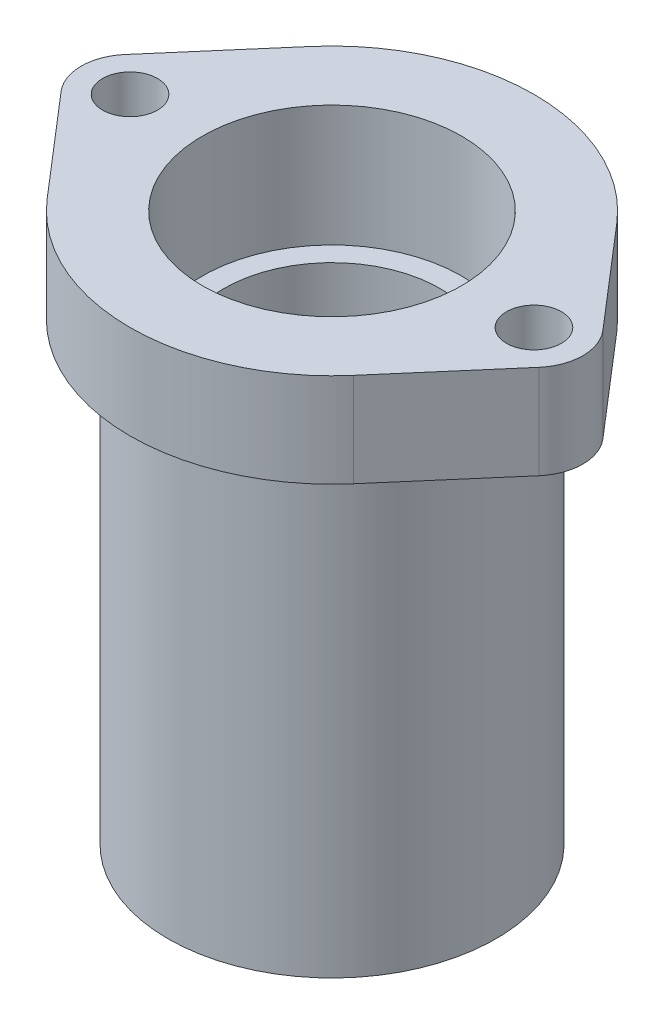
ISO-10303-21;
HEADER;
FILE_DESCRIPTION(('STEP AP214'),'2;1');
FILE_NAME('part.step','',(''),(''),'','','');
FILE_SCHEMA(('AUTOMOTIVE_DESIGN { 1 0 10303 214 1 1 1 1 }'));
ENDSEC;
DATA;
#1=APPLICATION_CONTEXT('core data for automotive mechanical design processes');
#2=APPLICATION_PROTOCOL_DEFINITION('international standard','automotive_design',2000,#1);
#3=PRODUCT_CONTEXT('',#1,'mechanical');
#4=PRODUCT('Part','Part','',(#3));
#5=PRODUCT_RELATED_PRODUCT_CATEGORY('part','',(#4));
#6=PRODUCT_DEFINITION_FORMATION('','',#4);
#7=PRODUCT_DEFINITION_CONTEXT('part definition',#1,'design');
#8=PRODUCT_DEFINITION('design','',#6,#7);
#9=PRODUCT_DEFINITION_SHAPE('','',#8);
#10=(LENGTH_UNIT() NAMED_UNIT(*) SI_UNIT(.MILLI.,.METRE.));
#11=(NAMED_UNIT(*) PLANE_ANGLE_UNIT() SI_UNIT($,.RADIAN.));
#12=(NAMED_UNIT(*) SI_UNIT($,.STERADIAN.) SOLID_ANGLE_UNIT());
#13=UNCERTAINTY_MEASURE_WITH_UNIT(LENGTH_MEASURE(1.E-05),#10,'distance_accuracy_value','');
#14=(GEOMETRIC_REPRESENTATION_CONTEXT(3) GLOBAL_UNCERTAINTY_ASSIGNED_CONTEXT((#13)) GLOBAL_UNIT_ASSIGNED_CONTEXT((#10,
#11,#12)) REPRESENTATION_CONTEXT('',''));
#15=CARTESIAN_POINT('',(0.,0.,0.));
#16=DIRECTION('',(0.,0.,1.));
#17=DIRECTION('',(1.,0.,0.));
#18=AXIS2_PLACEMENT_3D('',#15,#16,#17);
#19=CARTESIAN_POINT('',(-12.7,5.9055,0.));
#20=DIRECTION('',(0.,1.,0.));
#21=DIRECTION('',(0.,0.,1.));
#22=AXIS2_PLACEMENT_3D('',#19,#20,#21);
#23=PLANE('',#22);
#24=CARTESIAN_POINT('',(0.,5.9055,0.));
#25=DIRECTION('',(0.,1.,0.));
#26=DIRECTION('',(0.,0.,1.));
#27=AXIS2_PLACEMENT_3D('',#24,#25,#26);
#28=CIRCLE('',#27,8.1534);
#29=CARTESIAN_POINT('',(0.,5.9055,8.1534));
#30=VERTEX_POINT('',#29);
#31=EDGE_CURVE('E167',#30,#30,#28,.T.);
#32=ORIENTED_EDGE('',*,*,#31,.F.);
#33=EDGE_LOOP('',(#32));
#34=FACE_BOUND('',#33,.T.);
#35=CARTESIAN_POINT('',(-12.7,5.9055,0.));
#36=DIRECTION('',(0.,1.,0.));
#37=DIRECTION('',(0.,0.,1.));
#38=AXIS2_PLACEMENT_3D('',#35,#36,#37);
#39=CIRCLE('',#38,1.7272);
#40=CARTESIAN_POINT('',(-12.7,5.9055,1.7272));
#41=VERTEX_POINT('',#40);
#42=EDGE_CURVE('E141',#41,#41,#39,.T.);
#43=ORIENTED_EDGE('',*,*,#42,.F.);
#44=EDGE_LOOP('',(#43));
#45=FACE_BOUND('',#44,.T.);
#46=CARTESIAN_POINT('',(-12.7,5.9055,0.));
#47=DIRECTION('',(0.,1.,0.));
#48=DIRECTION('',(0.,0.,1.));
#49=AXIS2_PLACEMENT_3D('',#46,#47,#48);
#50=CIRCLE('',#49,3.0734);
#51=CARTESIAN_POINT('',(-15.0296372,5.9055,-2.00463913869209));
#52=VERTEX_POINT('',#51);
#53=CARTESIAN_POINT('',(-15.0296372,5.9055,2.00463913869209));
#54=VERTEX_POINT('',#53);
#55=EDGE_CURVE('E152',#52,#54,#50,.T.);
#56=ORIENTED_EDGE('',*,*,#55,.T.);
#57=DIRECTION('',(0.652254551536438,0.,0.758));
#58=VECTOR('',#57,1.);
#59=CARTESIAN_POINT('',(-15.0296372,5.9055,2.00463913869209));
#60=LINE('',#59,#58);
#61=CARTESIAN_POINT('',(-9.62660000000001,5.9055,8.28363280451276));
#62=VERTEX_POINT('',#61);
#63=EDGE_CURVE('E100',#54,#62,#60,.T.);
#64=ORIENTED_EDGE('',*,*,#63,.T.);
#65=CARTESIAN_POINT('',(0.,5.9055,0.));
#66=DIRECTION('',(0.,1.,0.));
#67=DIRECTION('',(0.,0.,1.));
#68=AXIS2_PLACEMENT_3D('',#65,#66,#67);
#69=CIRCLE('',#68,12.7);
#70=CARTESIAN_POINT('',(9.6266,5.9055,8.28363280451276));
#71=VERTEX_POINT('',#70);
#72=EDGE_CURVE('E200',#62,#71,#69,.T.);
#73=ORIENTED_EDGE('',*,*,#72,.T.);
#74=DIRECTION('',(0.652254551536438,0.,-0.758));
#75=VECTOR('',#74,1.);
#76=CARTESIAN_POINT('',(15.0296372,5.9055,2.00463913869209));
#77=LINE('',#76,#75);
#78=CARTESIAN_POINT('',(15.0296372,5.9055,2.00463913869209));
#79=VERTEX_POINT('',#78);
#80=EDGE_CURVE('E202',#71,#79,#77,.T.);
#81=ORIENTED_EDGE('',*,*,#80,.T.);
#82=CARTESIAN_POINT('',(12.7,5.9055,0.));
#83=DIRECTION('',(0.,1.,0.));
#84=DIRECTION('',(0.,0.,1.));
#85=AXIS2_PLACEMENT_3D('',#82,#83,#84);
#86=CIRCLE('',#85,3.0734);
#87=CARTESIAN_POINT('',(15.0296372,5.9055,-2.00463913869209));
#88=VERTEX_POINT('',#87);
#89=EDGE_CURVE('E119',#79,#88,#86,.T.);
#90=ORIENTED_EDGE('',*,*,#89,.T.);
#91=DIRECTION('',(-0.652254551536438,0.,-0.758));
#92=VECTOR('',#91,1.);
#93=CARTESIAN_POINT('',(9.6266,5.9055,-8.28363280451276));
#94=LINE('',#93,#92);
#95=CARTESIAN_POINT('',(9.6266,5.9055,-8.28363280451276));
#96=VERTEX_POINT('',#95);
#97=EDGE_CURVE('E113',#88,#96,#94,.T.);
#98=ORIENTED_EDGE('',*,*,#97,.T.);
#99=CARTESIAN_POINT('',(0.,5.9055,0.));
#100=DIRECTION('',(0.,1.,0.));
#101=DIRECTION('',(0.,0.,1.));
#102=AXIS2_PLACEMENT_3D('',#99,#100,#101);
#103=CIRCLE('',#102,12.7);
#104=CARTESIAN_POINT('',(-9.6266,5.9055,-8.28363280451276));
#105=VERTEX_POINT('',#104);
#106=EDGE_CURVE('E117',#96,#105,#103,.T.);
#107=ORIENTED_EDGE('',*,*,#106,.T.);
#108=DIRECTION('',(-0.652254551536438,0.,0.758));
#109=VECTOR('',#108,1.);
#110=CARTESIAN_POINT('',(-15.0296372,5.9055,-2.00463913869209));
#111=LINE('',#110,#109);
#112=EDGE_CURVE('E56',#105,#52,#111,.T.);
#113=ORIENTED_EDGE('',*,*,#112,.T.);
#114=EDGE_LOOP('',(#56,#64,#73,#81,#90,#98,#107,#113));
#115=FACE_BOUND('',#114,.T.);
#116=CARTESIAN_POINT('',(12.7,5.9055,0.));
#117=DIRECTION('',(0.,1.,0.));
#118=DIRECTION('',(0.,0.,1.));
#119=AXIS2_PLACEMENT_3D('',#116,#117,#118);
#120=CIRCLE('',#119,1.7272);
#121=CARTESIAN_POINT('',(12.7,5.9055,1.7272));
#122=VERTEX_POINT('',#121);
#123=EDGE_CURVE('E188',#122,#122,#120,.T.);
#124=ORIENTED_EDGE('',*,*,#123,.F.);
#125=EDGE_LOOP('',(#124));
#126=FACE_BOUND('',#125,.T.);
#127=ADVANCED_FACE('F37',(#34,#45,#115,#126),#23,.T.);
#128=CARTESIAN_POINT('',(-12.7,0.,0.));
#129=DIRECTION('',(0.,1.,0.));
#130=DIRECTION('',(0.,0.,1.));
#131=AXIS2_PLACEMENT_3D('',#128,#129,#130);
#132=PLANE('',#131);
#133=CARTESIAN_POINT('',(0.,0.,0.));
#134=DIRECTION('',(0.,1.,0.));
#135=DIRECTION('',(0.,0.,1.));
#136=AXIS2_PLACEMENT_3D('',#133,#134,#135);
#137=CIRCLE('',#136,10.31875);
#138=CARTESIAN_POINT('',(0.,0.,10.31875));
#139=VERTEX_POINT('',#138);
#140=EDGE_CURVE('E11',#139,#139,#137,.F.);
#141=ORIENTED_EDGE('',*,*,#140,.F.);
#142=EDGE_LOOP('',(#141));
#143=FACE_BOUND('',#142,.T.);
#144=CARTESIAN_POINT('',(-12.7,0.,0.));
#145=DIRECTION('',(0.,1.,0.));
#146=DIRECTION('',(0.,0.,1.));
#147=AXIS2_PLACEMENT_3D('',#144,#145,#146);
#148=CIRCLE('',#147,3.0734);
#149=CARTESIAN_POINT('',(-15.0296372,0.,-2.00463913869209));
#150=VERTEX_POINT('',#149);
#151=CARTESIAN_POINT('',(-15.0296372,0.,2.00463913869209));
#152=VERTEX_POINT('',#151);
#153=EDGE_CURVE('E137',#150,#152,#148,.T.);
#154=ORIENTED_EDGE('',*,*,#153,.F.);
#155=DIRECTION('',(-0.652254551536438,0.,0.758));
#156=VECTOR('',#155,1.);
#157=CARTESIAN_POINT('',(-15.0296372,0.,-2.00463913869209));
#158=LINE('',#157,#156);
#159=CARTESIAN_POINT('',(-9.6266,0.,-8.28363280451276));
#160=VERTEX_POINT('',#159);
#161=EDGE_CURVE('E91',#160,#150,#158,.T.);
#162=ORIENTED_EDGE('',*,*,#161,.F.);
#163=CARTESIAN_POINT('',(0.,0.,0.));
#164=DIRECTION('',(0.,1.,0.));
#165=DIRECTION('',(0.,0.,1.));
#166=AXIS2_PLACEMENT_3D('',#163,#164,#165);
#167=CIRCLE('',#166,12.7);
#168=CARTESIAN_POINT('',(9.6266,0.,-8.28363280451276));
#169=VERTEX_POINT('',#168);
#170=EDGE_CURVE('E85',#169,#160,#167,.T.);
#171=ORIENTED_EDGE('',*,*,#170,.F.);
#172=DIRECTION('',(-0.652254551536438,0.,-0.758));
#173=VECTOR('',#172,1.);
#174=CARTESIAN_POINT('',(9.6266,0.,-8.28363280451276));
#175=LINE('',#174,#173);
#176=CARTESIAN_POINT('',(15.0296372,0.,-2.00463913869209));
#177=VERTEX_POINT('',#176);
#178=EDGE_CURVE('E127',#177,#169,#175,.T.);
#179=ORIENTED_EDGE('',*,*,#178,.F.);
#180=CARTESIAN_POINT('',(12.7,0.,0.));
#181=DIRECTION('',(0.,1.,0.));
#182=DIRECTION('',(0.,0.,1.));
#183=AXIS2_PLACEMENT_3D('',#180,#181,#182);
#184=CIRCLE('',#183,3.0734);
#185=CARTESIAN_POINT('',(15.0296372,0.,2.00463913869209));
#186=VERTEX_POINT('',#185);
#187=EDGE_CURVE('E147',#186,#177,#184,.T.);
#188=ORIENTED_EDGE('',*,*,#187,.F.);
#189=DIRECTION('',(0.652254551536438,0.,-0.758));
#190=VECTOR('',#189,1.);
#191=CARTESIAN_POINT('',(15.0296372,0.,2.00463913869209));
#192=LINE('',#191,#190);
#193=CARTESIAN_POINT('',(9.6266,0.,8.28363280451276));
#194=VERTEX_POINT('',#193);
#195=EDGE_CURVE('E145',#194,#186,#192,.T.);
#196=ORIENTED_EDGE('',*,*,#195,.F.);
#197=CARTESIAN_POINT('',(0.,0.,0.));
#198=DIRECTION('',(0.,1.,0.));
#199=DIRECTION('',(0.,0.,1.));
#200=AXIS2_PLACEMENT_3D('',#197,#198,#199);
#201=CIRCLE('',#200,12.7);
#202=CARTESIAN_POINT('',(-9.62660000000001,0.,8.28363280451276));
#203=VERTEX_POINT('',#202);
#204=EDGE_CURVE('E143',#203,#194,#201,.T.);
#205=ORIENTED_EDGE('',*,*,#204,.F.);
#206=DIRECTION('',(0.652254551536438,0.,0.758));
#207=VECTOR('',#206,1.);
#208=CARTESIAN_POINT('',(-15.0296372,0.,2.00463913869209));
#209=LINE('',#208,#207);
#210=EDGE_CURVE('E140',#152,#203,#209,.T.);
#211=ORIENTED_EDGE('',*,*,#210,.F.);
#212=EDGE_LOOP('',(#154,#162,#171,#179,#188,#196,#205,#211));
#213=FACE_BOUND('',#212,.T.);
#214=CARTESIAN_POINT('',(-12.7,0.,0.));
#215=DIRECTION('',(0.,1.,0.));
#216=DIRECTION('',(0.,0.,1.));
#217=AXIS2_PLACEMENT_3D('',#214,#215,#216);
#218=CIRCLE('',#217,1.7272);
#219=CARTESIAN_POINT('',(-12.7,0.,1.7272));
#220=VERTEX_POINT('',#219);
#221=EDGE_CURVE('E191',#220,#220,#218,.T.);
#222=ORIENTED_EDGE('',*,*,#221,.T.);
#223=EDGE_LOOP('',(#222));
#224=FACE_BOUND('',#223,.T.);
#225=CARTESIAN_POINT('',(12.7,0.,0.));
#226=DIRECTION('',(0.,1.,0.));
#227=DIRECTION('',(0.,0.,1.));
#228=AXIS2_PLACEMENT_3D('',#225,#226,#227);
#229=CIRCLE('',#228,1.7272);
#230=CARTESIAN_POINT('',(12.7,0.,1.7272));
#231=VERTEX_POINT('',#230);
#232=EDGE_CURVE('E187',#231,#231,#229,.T.);
#233=ORIENTED_EDGE('',*,*,#232,.T.);
#234=EDGE_LOOP('',(#233));
#235=FACE_BOUND('',#234,.T.);
#236=ADVANCED_FACE('F215',(#143,#213,#224,#235),#132,.F.);
#237=CARTESIAN_POINT('',(-12.7,5.9055,0.));
#238=DIRECTION('',(0.,-1.,0.));
#239=DIRECTION('',(0.,0.,-1.));
#240=AXIS2_PLACEMENT_3D('',#237,#238,#239);
#241=CYLINDRICAL_SURFACE('',#240,3.0734);
#242=ORIENTED_EDGE('',*,*,#153,.T.);
#243=DIRECTION('',(0.,-1.,0.));
#244=VECTOR('',#243,1.);
#245=CARTESIAN_POINT('',(-15.0296372,5.9055,2.00463913869209));
#246=LINE('',#245,#244);
#247=EDGE_CURVE('E47',#54,#152,#246,.T.);
#248=ORIENTED_EDGE('',*,*,#247,.F.);
#249=ORIENTED_EDGE('',*,*,#55,.F.);
#250=DIRECTION('',(0.,-1.,0.));
#251=VECTOR('',#250,1.);
#252=CARTESIAN_POINT('',(-15.0296372,5.9055,-2.00463913869209));
#253=LINE('',#252,#251);
#254=EDGE_CURVE('E133',#52,#150,#253,.T.);
#255=ORIENTED_EDGE('',*,*,#254,.T.);
#256=EDGE_LOOP('',(#242,#248,#249,#255));
#257=FACE_BOUND('',#256,.T.);
#258=ADVANCED_FACE('F39',(#257),#241,.T.);
#259=CARTESIAN_POINT('',(-15.0296372,5.9055,2.00463913869209));
#260=DIRECTION('',(0.758,0.,-0.652254551536438));
#261=DIRECTION('',(-0.652254551536438,0.,-0.758));
#262=AXIS2_PLACEMENT_3D('',#259,#260,#261);
#263=PLANE('',#262);
#264=ORIENTED_EDGE('',*,*,#210,.T.);
#265=DIRECTION('',(0.,-1.,0.));
#266=VECTOR('',#265,1.);
#267=CARTESIAN_POINT('',(-9.62660000000001,5.9055,8.28363280451276));
#268=LINE('',#267,#266);
#269=EDGE_CURVE('E162',#62,#203,#268,.T.);
#270=ORIENTED_EDGE('',*,*,#269,.F.);
#271=ORIENTED_EDGE('',*,*,#63,.F.);
#272=ORIENTED_EDGE('',*,*,#247,.T.);
#273=EDGE_LOOP('',(#264,#270,#271,#272));
#274=FACE_BOUND('',#273,.T.);
#275=ADVANCED_FACE('F360',(#274),#263,.F.);
#276=CARTESIAN_POINT('',(0.,5.9055,0.));
#277=DIRECTION('',(0.,-1.,0.));
#278=DIRECTION('',(0.,0.,-1.));
#279=AXIS2_PLACEMENT_3D('',#276,#277,#278);
#280=CYLINDRICAL_SURFACE('',#279,12.7);
#281=ORIENTED_EDGE('',*,*,#204,.T.);
#282=DIRECTION('',(0.,-1.,0.));
#283=VECTOR('',#282,1.);
#284=CARTESIAN_POINT('',(9.6266,5.9055,8.28363280451276));
#285=LINE('',#284,#283);
#286=EDGE_CURVE('E159',#71,#194,#285,.T.);
#287=ORIENTED_EDGE('',*,*,#286,.F.);
#288=ORIENTED_EDGE('',*,*,#72,.F.);
#289=ORIENTED_EDGE('',*,*,#269,.T.);
#290=EDGE_LOOP('',(#281,#287,#288,#289));
#291=FACE_BOUND('',#290,.T.);
#292=ADVANCED_FACE('F351',(#291),#280,.T.);
#293=CARTESIAN_POINT('',(15.0296372,5.9055,2.00463913869209));
#294=DIRECTION('',(-0.758,0.,-0.652254551536438));
#295=DIRECTION('',(-0.652254551536438,0.,0.758));
#296=AXIS2_PLACEMENT_3D('',#293,#294,#295);
#297=PLANE('',#296);
#298=ORIENTED_EDGE('',*,*,#195,.T.);
#299=DIRECTION('',(0.,-1.,0.));
#300=VECTOR('',#299,1.);
#301=CARTESIAN_POINT('',(15.0296372,5.9055,2.00463913869209));
#302=LINE('',#301,#300);
#303=EDGE_CURVE('E156',#79,#186,#302,.T.);
#304=ORIENTED_EDGE('',*,*,#303,.F.);
#305=ORIENTED_EDGE('',*,*,#80,.F.);
#306=ORIENTED_EDGE('',*,*,#286,.T.);
#307=EDGE_LOOP('',(#298,#304,#305,#306));
#308=FACE_BOUND('',#307,.T.);
#309=ADVANCED_FACE('F208',(#308),#297,.F.);
#310=CARTESIAN_POINT('',(12.7,5.9055,0.));
#311=DIRECTION('',(0.,-1.,0.));
#312=DIRECTION('',(0.,0.,-1.));
#313=AXIS2_PLACEMENT_3D('',#310,#311,#312);
#314=CYLINDRICAL_SURFACE('',#313,3.0734);
#315=ORIENTED_EDGE('',*,*,#187,.T.);
#316=DIRECTION('',(0.,-1.,0.));
#317=VECTOR('',#316,1.);
#318=CARTESIAN_POINT('',(15.0296372,5.9055,-2.00463913869209));
#319=LINE('',#318,#317);
#320=EDGE_CURVE('E128',#88,#177,#319,.T.);
#321=ORIENTED_EDGE('',*,*,#320,.F.);
#322=ORIENTED_EDGE('',*,*,#89,.F.);
#323=ORIENTED_EDGE('',*,*,#303,.T.);
#324=EDGE_LOOP('',(#315,#321,#322,#323));
#325=FACE_BOUND('',#324,.T.);
#326=ADVANCED_FACE('F212',(#325),#314,.T.);
#327=CARTESIAN_POINT('',(9.6266,5.9055,-8.28363280451276));
#328=DIRECTION('',(-0.758,0.,0.652254551536438));
#329=DIRECTION('',(0.652254551536438,0.,0.758));
#330=AXIS2_PLACEMENT_3D('',#327,#328,#329);
#331=PLANE('',#330);
#332=ORIENTED_EDGE('',*,*,#178,.T.);
#333=DIRECTION('',(0.,-1.,0.));
#334=VECTOR('',#333,1.);
#335=CARTESIAN_POINT('',(9.6266,5.9055,-8.28363280451276));
#336=LINE('',#335,#334);
#337=EDGE_CURVE('E124',#96,#169,#336,.T.);
#338=ORIENTED_EDGE('',*,*,#337,.F.);
#339=ORIENTED_EDGE('',*,*,#97,.F.);
#340=ORIENTED_EDGE('',*,*,#320,.T.);
#341=EDGE_LOOP('',(#332,#338,#339,#340));
#342=FACE_BOUND('',#341,.T.);
#343=ADVANCED_FACE('F125',(#342),#331,.F.);
#344=CARTESIAN_POINT('',(0.,5.9055,0.));
#345=DIRECTION('',(0.,-1.,0.));
#346=DIRECTION('',(0.,0.,-1.));
#347=AXIS2_PLACEMENT_3D('',#344,#345,#346);
#348=CYLINDRICAL_SURFACE('',#347,12.7);
#349=ORIENTED_EDGE('',*,*,#170,.T.);
#350=DIRECTION('',(0.,-1.,0.));
#351=VECTOR('',#350,1.);
#352=CARTESIAN_POINT('',(-9.6266,5.9055,-8.28363280451276));
#353=LINE('',#352,#351);
#354=EDGE_CURVE('E129',#105,#160,#353,.T.);
#355=ORIENTED_EDGE('',*,*,#354,.F.);
#356=ORIENTED_EDGE('',*,*,#106,.F.);
#357=ORIENTED_EDGE('',*,*,#337,.T.);
#358=EDGE_LOOP('',(#349,#355,#356,#357));
#359=FACE_BOUND('',#358,.T.);
#360=ADVANCED_FACE('F131',(#359),#348,.T.);
#361=CARTESIAN_POINT('',(-15.0296372,5.9055,-2.00463913869209));
#362=DIRECTION('',(0.758,0.,0.652254551536438));
#363=DIRECTION('',(0.652254551536438,0.,-0.758));
#364=AXIS2_PLACEMENT_3D('',#361,#362,#363);
#365=PLANE('',#364);
#366=ORIENTED_EDGE('',*,*,#161,.T.);
#367=ORIENTED_EDGE('',*,*,#254,.F.);
#368=ORIENTED_EDGE('',*,*,#112,.F.);
#369=ORIENTED_EDGE('',*,*,#354,.T.);
#370=EDGE_LOOP('',(#366,#367,#368,#369));
#371=FACE_BOUND('',#370,.T.);
#372=ADVANCED_FACE('F221',(#371),#365,.F.);
#373=CARTESIAN_POINT('',(-12.7,5.9055,0.));
#374=DIRECTION('',(0.,-1.,0.));
#375=DIRECTION('',(0.,0.,-1.));
#376=AXIS2_PLACEMENT_3D('',#373,#374,#375);
#377=CYLINDRICAL_SURFACE('',#376,1.7272);
#378=ORIENTED_EDGE('',*,*,#42,.T.);
#379=EDGE_LOOP('',(#378));
#380=FACE_BOUND('',#379,.T.);
#381=ORIENTED_EDGE('',*,*,#221,.F.);
#382=EDGE_LOOP('',(#381));
#383=FACE_BOUND('',#382,.T.);
#384=ADVANCED_FACE('F223',(#380,#383),#377,.F.);
#385=CARTESIAN_POINT('',(12.7,5.9055,0.));
#386=DIRECTION('',(0.,-1.,0.));
#387=DIRECTION('',(0.,0.,-1.));
#388=AXIS2_PLACEMENT_3D('',#385,#386,#387);
#389=CYLINDRICAL_SURFACE('',#388,1.7272);
#390=ORIENTED_EDGE('',*,*,#123,.T.);
#391=EDGE_LOOP('',(#390));
#392=FACE_BOUND('',#391,.T.);
#393=ORIENTED_EDGE('',*,*,#232,.F.);
#394=EDGE_LOOP('',(#393));
#395=FACE_BOUND('',#394,.T.);
#396=ADVANCED_FACE('F229',(#392,#395),#389,.F.);
#397=CARTESIAN_POINT('',(0.,-28.575,0.));
#398=DIRECTION('',(0.,1.,0.));
#399=DIRECTION('',(0.,0.,1.));
#400=AXIS2_PLACEMENT_3D('',#397,#398,#399);
#401=CYLINDRICAL_SURFACE('',#400,10.31875);
#402=CARTESIAN_POINT('',(0.,-28.575,0.));
#403=DIRECTION('',(0.,-1.,0.));
#404=DIRECTION('',(0.,0.,-1.));
#405=AXIS2_PLACEMENT_3D('',#402,#403,#404);
#406=CIRCLE('',#405,10.31875);
#407=CARTESIAN_POINT('',(0.,-28.575,-10.31875));
#408=VERTEX_POINT('',#407);
#409=EDGE_CURVE('E183',#408,#408,#406,.T.);
#410=ORIENTED_EDGE('',*,*,#409,.F.);
#411=EDGE_LOOP('',(#410));
#412=FACE_BOUND('',#411,.T.);
#413=ORIENTED_EDGE('',*,*,#140,.T.);
#414=EDGE_LOOP('',(#413));
#415=FACE_BOUND('',#414,.T.);
#416=ADVANCED_FACE('F246',(#412,#415),#401,.T.);
#417=CARTESIAN_POINT('',(0.,-28.575,0.));
#418=DIRECTION('',(0.,-1.,0.));
#419=DIRECTION('',(0.,0.,-1.));
#420=AXIS2_PLACEMENT_3D('',#417,#418,#419);
#421=PLANE('',#420);
#422=CARTESIAN_POINT('',(0.,-28.575,0.));
#423=DIRECTION('',(0.,1.,0.));
#424=DIRECTION('',(0.,0.,1.));
#425=AXIS2_PLACEMENT_3D('',#422,#423,#424);
#426=CIRCLE('',#425,5.08);
#427=CARTESIAN_POINT('',(0.,-28.575,5.08));
#428=VERTEX_POINT('',#427);
#429=EDGE_CURVE('E179',#428,#428,#426,.T.);
#430=ORIENTED_EDGE('',*,*,#429,.T.);
#431=EDGE_LOOP('',(#430));
#432=FACE_BOUND('',#431,.T.);
#433=ORIENTED_EDGE('',*,*,#409,.T.);
#434=EDGE_LOOP('',(#433));
#435=FACE_BOUND('',#434,.T.);
#436=ADVANCED_FACE('F250',(#432,#435),#421,.T.);
#437=CARTESIAN_POINT('',(0.,-1.7145,0.));
#438=DIRECTION('',(0.,1.,0.));
#439=DIRECTION('',(0.,0.,1.));
#440=AXIS2_PLACEMENT_3D('',#437,#438,#439);
#441=CYLINDRICAL_SURFACE('',#440,8.1534);
#442=CARTESIAN_POINT('',(0.,-1.7145,0.));
#443=DIRECTION('',(0.,1.,0.));
#444=DIRECTION('',(0.,0.,1.));
#445=AXIS2_PLACEMENT_3D('',#442,#443,#444);
#446=CIRCLE('',#445,8.1534);
#447=CARTESIAN_POINT('',(0.,-1.7145,8.1534));
#448=VERTEX_POINT('',#447);
#449=EDGE_CURVE('E172',#448,#448,#446,.T.);
#450=CARTESIAN_POINT('',(0.,-1.7145,8.1534));
#451=CARTESIAN_POINT('',(0.,-1.635125,8.1534));
#452=CARTESIAN_POINT('',(0.,-1.55575,8.1534));
#453=CARTESIAN_POINT('',(0.,-1.397,8.1534));
#454=CARTESIAN_POINT('',(0.,-1.317625,8.1534));
#455=CARTESIAN_POINT('',(0.,-1.158875,8.1534));
#456=CARTESIAN_POINT('',(0.,-1.0795,8.1534));
#457=CARTESIAN_POINT('',(0.,-0.920749999999999,8.1534));
#458=CARTESIAN_POINT('',(0.,-0.841374999999999,8.1534));
#459=CARTESIAN_POINT('',(0.,-0.682624999999999,8.1534));
#460=CARTESIAN_POINT('',(0.,-0.603249999999999,8.1534));
#461=CARTESIAN_POINT('',(0.,-0.444499999999999,8.1534));
#462=CARTESIAN_POINT('',(0.,-0.365124999999999,8.1534));
#463=CARTESIAN_POINT('',(0.,-0.206374999999999,8.1534));
#464=CARTESIAN_POINT('',(0.,-0.126999999999999,8.1534));
#465=CARTESIAN_POINT('',(0.,0.0317500000000007,8.1534));
#466=CARTESIAN_POINT('',(0.,0.111125000000001,8.1534));
#467=CARTESIAN_POINT('',(0.,0.269875000000001,8.1534));
#468=CARTESIAN_POINT('',(0.,0.349250000000001,8.1534));
#469=CARTESIAN_POINT('',(0.,0.508000000000001,8.1534));
#470=CARTESIAN_POINT('',(0.,0.587375000000001,8.1534));
#471=CARTESIAN_POINT('',(0.,0.746125000000001,8.1534));
#472=CARTESIAN_POINT('',(0.,0.825500000000001,8.1534));
#473=CARTESIAN_POINT('',(0.,0.984250000000001,8.1534));
#474=CARTESIAN_POINT('',(0.,1.063625,8.1534));
#475=CARTESIAN_POINT('',(0.,1.222375,8.1534));
#476=CARTESIAN_POINT('',(0.,1.30175,8.1534));
#477=CARTESIAN_POINT('',(0.,1.4605,8.1534));
#478=CARTESIAN_POINT('',(0.,1.539875,8.1534));
#479=CARTESIAN_POINT('',(0.,1.698625,8.1534));
#480=CARTESIAN_POINT('',(0.,1.778,8.1534));
#481=CARTESIAN_POINT('',(0.,1.93675,8.1534));
#482=CARTESIAN_POINT('',(0.,2.016125,8.1534));
#483=CARTESIAN_POINT('',(0.,2.174875,8.1534));
#484=CARTESIAN_POINT('',(0.,2.25425,8.1534));
#485=CARTESIAN_POINT('',(0.,2.413,8.1534));
#486=CARTESIAN_POINT('',(0.,2.492375,8.1534));
#487=CARTESIAN_POINT('',(0.,2.651125,8.1534));
#488=CARTESIAN_POINT('',(0.,2.7305,8.1534));
#489=CARTESIAN_POINT('',(0.,2.88925,8.1534));
#490=CARTESIAN_POINT('',(0.,2.968625,8.1534));
#491=CARTESIAN_POINT('',(0.,3.127375,8.1534));
#492=CARTESIAN_POINT('',(0.,3.20675,8.1534));
#493=CARTESIAN_POINT('',(0.,3.3655,8.1534));
#494=CARTESIAN_POINT('',(0.,3.444875,8.1534));
#495=CARTESIAN_POINT('',(0.,3.603625,8.1534));
#496=CARTESIAN_POINT('',(0.,3.683,8.1534));
#497=CARTESIAN_POINT('',(0.,3.84175,8.1534));
#498=CARTESIAN_POINT('',(0.,3.921125,8.1534));
#499=CARTESIAN_POINT('',(0.,4.079875,8.1534));
#500=CARTESIAN_POINT('',(0.,4.15925,8.1534));
#501=CARTESIAN_POINT('',(0.,4.318,8.1534));
#502=CARTESIAN_POINT('',(0.,4.397375,8.1534));
#503=CARTESIAN_POINT('',(0.,4.556125,8.1534));
#504=CARTESIAN_POINT('',(0.,4.6355,8.1534));
#505=CARTESIAN_POINT('',(0.,4.79425,8.1534));
#506=CARTESIAN_POINT('',(0.,4.873625,8.1534));
#507=CARTESIAN_POINT('',(0.,5.032375,8.1534));
#508=CARTESIAN_POINT('',(0.,5.11175,8.1534));
#509=CARTESIAN_POINT('',(0.,5.2705,8.1534));
#510=CARTESIAN_POINT('',(0.,5.349875,8.1534));
#511=CARTESIAN_POINT('',(0.,5.508625,8.1534));
#512=CARTESIAN_POINT('',(0.,5.588,8.1534));
#513=CARTESIAN_POINT('',(0.,5.74675,8.1534));
#514=CARTESIAN_POINT('',(0.,5.826125,8.1534));
#515=CARTESIAN_POINT('',(0.,5.9055,8.1534));
#516=B_SPLINE_CURVE_WITH_KNOTS('',3,(#450,#451,#452,#453,#454,#455,#456,#457,#458,#459,#460,
#461,#462,#463,#464,#465,#466,#467,#468,#469,#470,#471,#472,#473,#474,#475,#476,#477,#478,#479,
#480,#481,#482,#483,#484,#485,#486,#487,#488,#489,#490,#491,#492,#493,#494,#495,#496,#497,#498,
#499,#500,#501,#502,#503,#504,#505,#506,#507,#508,#509,#510,#511,#512,#513,#514,#515),
.UNSPECIFIED.,.F.,.F.,(4,2,2,2,2,2,2,2,2,2,2,2,2,2,2,2,2,2,2,2,2,2,2,2,2,2,2,2,2,2,2,2,4),(0.,
0.238125,0.47625,0.714375,0.9525,1.190625,1.42875,1.666875,1.905,2.143125,2.38125,2.619375,
2.8575,3.095625,3.33375,3.571875,3.81,4.048125,4.28625,4.524375,4.7625,5.000625,5.23875,
5.476875,5.715,5.953125,6.19125,6.429375,6.6675,6.905625,7.14375,7.381875,7.62),.UNSPECIFIED.);
#517=EDGE_CURVE('BSEAM254',#448,#30,#516,.T.);
#518=ORIENTED_EDGE('',*,*,#449,.F.);
#519=ORIENTED_EDGE('',*,*,#31,.T.);
#520=ORIENTED_EDGE('',*,*,#517,.T.);
#521=ORIENTED_EDGE('',*,*,#517,.F.);
#522=EDGE_LOOP('',(#518,#520,#519,#521));
#523=FACE_BOUND('',#522,.T.);
#524=ADVANCED_FACE('F254',(#523),#441,.F.);
#525=CARTESIAN_POINT('',(0.,-1.7145,0.));
#526=DIRECTION('',(0.,1.,0.));
#527=DIRECTION('',(0.,0.,1.));
#528=AXIS2_PLACEMENT_3D('',#525,#526,#527);
#529=PLANE('',#528);
#530=CARTESIAN_POINT('',(0.,-1.7145,0.));
#531=DIRECTION('',(0.,1.,0.));
#532=DIRECTION('',(0.,0.,1.));
#533=AXIS2_PLACEMENT_3D('',#530,#531,#532);
#534=CIRCLE('',#533,6.7945);
#535=CARTESIAN_POINT('',(0.,-1.7145,6.7945));
#536=VERTEX_POINT('',#535);
#537=EDGE_CURVE('E165',#536,#536,#534,.T.);
#538=ORIENTED_EDGE('',*,*,#537,.F.);
#539=EDGE_LOOP('',(#538));
#540=FACE_BOUND('',#539,.T.);
#541=ORIENTED_EDGE('',*,*,#449,.T.);
#542=EDGE_LOOP('',(#541));
#543=FACE_BOUND('',#542,.T.);
#544=ADVANCED_FACE('F258',(#540,#543),#529,.T.);
#545=CARTESIAN_POINT('',(0.,-10.3505,0.));
#546=DIRECTION('',(0.,1.,0.));
#547=DIRECTION('',(0.,0.,1.));
#548=AXIS2_PLACEMENT_3D('',#545,#546,#547);
#549=CYLINDRICAL_SURFACE('',#548,6.7945);
#550=ORIENTED_EDGE('',*,*,#537,.T.);
#551=EDGE_LOOP('',(#550));
#552=FACE_BOUND('',#551,.T.);
#553=CARTESIAN_POINT('',(0.,-10.3505,0.));
#554=DIRECTION('',(0.,1.,0.));
#555=DIRECTION('',(0.,0.,1.));
#556=AXIS2_PLACEMENT_3D('',#553,#554,#555);
#557=CIRCLE('',#556,6.7945);
#558=CARTESIAN_POINT('',(0.,-10.3505,6.7945));
#559=VERTEX_POINT('',#558);
#560=EDGE_CURVE('E168',#559,#559,#557,.T.);
#561=ORIENTED_EDGE('',*,*,#560,.F.);
#562=EDGE_LOOP('',(#561));
#563=FACE_BOUND('',#562,.T.);
#564=ADVANCED_FACE('F262',(#552,#563),#549,.F.);
#565=CARTESIAN_POINT('',(0.,-10.3505,0.));
#566=DIRECTION('',(0.,1.,0.));
#567=DIRECTION('',(0.,0.,1.));
#568=AXIS2_PLACEMENT_3D('',#565,#566,#567);
#569=PLANE('',#568);
#570=CARTESIAN_POINT('',(0.,-10.3505,0.));
#571=DIRECTION('',(0.,1.,0.));
#572=DIRECTION('',(0.,0.,1.));
#573=AXIS2_PLACEMENT_3D('',#570,#571,#572);
#574=CIRCLE('',#573,5.08);
#575=CARTESIAN_POINT('',(0.,-10.3505,5.08));
#576=VERTEX_POINT('',#575);
#577=EDGE_CURVE('E41',#576,#576,#574,.T.);
#578=ORIENTED_EDGE('',*,*,#577,.F.);
#579=EDGE_LOOP('',(#578));
#580=FACE_BOUND('',#579,.T.);
#581=ORIENTED_EDGE('',*,*,#560,.T.);
#582=EDGE_LOOP('',(#581));
#583=FACE_BOUND('',#582,.T.);
#584=ADVANCED_FACE('F266',(#580,#583),#569,.T.);
#585=CARTESIAN_POINT('',(0.,-28.575,0.));
#586=DIRECTION('',(0.,1.,0.));
#587=DIRECTION('',(0.,0.,1.));
#588=AXIS2_PLACEMENT_3D('',#585,#586,#587);
#589=CYLINDRICAL_SURFACE('',#588,5.08);
#590=ORIENTED_EDGE('',*,*,#577,.T.);
#591=EDGE_LOOP('',(#590));
#592=FACE_BOUND('',#591,.T.);
#593=ORIENTED_EDGE('',*,*,#429,.F.);
#594=EDGE_LOOP('',(#593));
#595=FACE_BOUND('',#594,.T.);
#596=ADVANCED_FACE('F269',(#592,#595),#589,.F.);
#597=CLOSED_SHELL('',(#127,#236,#258,#275,#292,#309,#326,#343,#360,#372,#384,#396,#416,#436,
#524,#544,#564,#584,#596));
#598=MANIFOLD_SOLID_BREP('B2',#597);
#599=ADVANCED_BREP_SHAPE_REPRESENTATION('',(#18,#598),#14);
#600=SHAPE_DEFINITION_REPRESENTATION(#9,#599);
ENDSEC;
END-ISO-10303-21;
